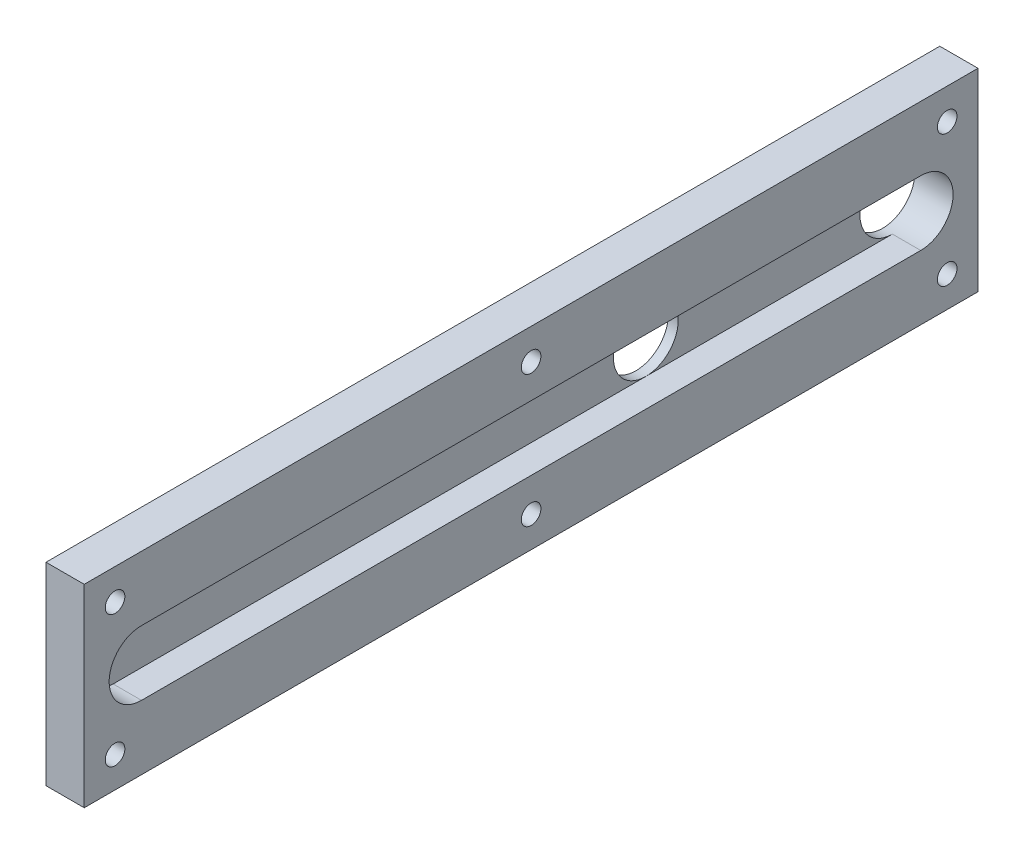
ISO-10303-21;
HEADER;
FILE_DESCRIPTION(('STEP AP214'),'2;1');
FILE_NAME('part.step','',(''),(''),'','','');
FILE_SCHEMA(('AUTOMOTIVE_DESIGN { 1 0 10303 214 1 1 1 1 }'));
ENDSEC;
DATA;
#1=APPLICATION_CONTEXT('core data for automotive mechanical design processes');
#2=APPLICATION_PROTOCOL_DEFINITION('international standard','automotive_design',2000,#1);
#3=PRODUCT_CONTEXT('',#1,'mechanical');
#4=PRODUCT('Part','Part','',(#3));
#5=PRODUCT_RELATED_PRODUCT_CATEGORY('part','',(#4));
#6=PRODUCT_DEFINITION_FORMATION('','',#4);
#7=PRODUCT_DEFINITION_CONTEXT('part definition',#1,'design');
#8=PRODUCT_DEFINITION('design','',#6,#7);
#9=PRODUCT_DEFINITION_SHAPE('','',#8);
#10=(LENGTH_UNIT() NAMED_UNIT(*) SI_UNIT(.MILLI.,.METRE.));
#11=(NAMED_UNIT(*) PLANE_ANGLE_UNIT() SI_UNIT($,.RADIAN.));
#12=(NAMED_UNIT(*) SI_UNIT($,.STERADIAN.) SOLID_ANGLE_UNIT());
#13=UNCERTAINTY_MEASURE_WITH_UNIT(LENGTH_MEASURE(1.E-05),#10,'distance_accuracy_value','');
#14=(GEOMETRIC_REPRESENTATION_CONTEXT(3) GLOBAL_UNCERTAINTY_ASSIGNED_CONTEXT((#13)) GLOBAL_UNIT_ASSIGNED_CONTEXT((#10,
#11,#12)) REPRESENTATION_CONTEXT('',''));
#15=CARTESIAN_POINT('',(0.,0.,0.));
#16=DIRECTION('',(0.,0.,1.));
#17=DIRECTION('',(1.,0.,0.));
#18=AXIS2_PLACEMENT_3D('',#15,#16,#17);
#19=CARTESIAN_POINT('',(7.874,-6.66750000000002,80.27524839));
#20=DIRECTION('',(0.,1.,0.));
#21=DIRECTION('',(0.,0.,1.));
#22=AXIS2_PLACEMENT_3D('',#19,#20,#21);
#23=PLANE('',#22);
#24=DIRECTION('',(0.,0.,-1.));
#25=VECTOR('',#24,1.);
#26=CARTESIAN_POINT('',(2.032,-6.6675,0.));
#27=LINE('',#26,#25);
#28=CARTESIAN_POINT('',(2.032,-6.6675,-29.47524839));
#29=VERTEX_POINT('',#28);
#30=CARTESIAN_POINT('',(2.032,-6.66749999999999,-80.2752483900001));
#31=VERTEX_POINT('',#30);
#32=EDGE_CURVE('E158',#29,#31,#27,.T.);
#33=ORIENTED_EDGE('',*,*,#32,.F.);
#34=DIRECTION('',(0.,0.,-1.));
#35=VECTOR('',#34,1.);
#36=CARTESIAN_POINT('',(2.032,-6.6675,0.));
#37=LINE('',#36,#35);
#38=CARTESIAN_POINT('',(2.032,-6.66750000000002,80.27524839));
#39=VERTEX_POINT('',#38);
#40=EDGE_CURVE('E64',#39,#29,#37,.T.);
#41=ORIENTED_EDGE('',*,*,#40,.F.);
#42=DIRECTION('',(-1.,0.,0.));
#43=VECTOR('',#42,1.);
#44=CARTESIAN_POINT('',(7.874,-6.66750000000002,80.27524839));
#45=LINE('',#44,#43);
#46=CARTESIAN_POINT('',(7.874,-6.66750000000002,80.27524839));
#47=VERTEX_POINT('',#46);
#48=EDGE_CURVE('E219',#47,#39,#45,.T.);
#49=ORIENTED_EDGE('',*,*,#48,.F.);
#50=DIRECTION('',(0.,0.,-1.));
#51=VECTOR('',#50,1.);
#52=CARTESIAN_POINT('',(7.874,-6.66750000000002,80.27524839));
#53=LINE('',#52,#51);
#54=CARTESIAN_POINT('',(7.874,-6.66749999999999,-80.2752483900001));
#55=VERTEX_POINT('',#54);
#56=EDGE_CURVE('E203',#47,#55,#53,.T.);
#57=ORIENTED_EDGE('',*,*,#56,.T.);
#58=DIRECTION('',(-1.,0.,0.));
#59=VECTOR('',#58,1.);
#60=CARTESIAN_POINT('',(7.874,-6.66749999999999,-80.2752483900001));
#61=LINE('',#60,#59);
#62=EDGE_CURVE('E217',#55,#31,#61,.T.);
#63=ORIENTED_EDGE('',*,*,#62,.T.);
#64=EDGE_LOOP('',(#33,#41,#49,#57,#63));
#65=FACE_BOUND('',#64,.T.);
#66=ADVANCED_FACE('F49',(#65),#23,.T.);
#67=CARTESIAN_POINT('',(7.874,0.,80.27524839));
#68=DIRECTION('',(-1.,0.,0.));
#69=DIRECTION('',(0.,0.,1.));
#70=AXIS2_PLACEMENT_3D('',#67,#68,#69);
#71=CYLINDRICAL_SURFACE('',#70,6.66750000000003);
#72=ORIENTED_EDGE('',*,*,#48,.T.);
#73=CARTESIAN_POINT('',(2.032,0.,80.27524839));
#74=DIRECTION('',(-1.,0.,0.));
#75=DIRECTION('',(0.,0.,1.));
#76=AXIS2_PLACEMENT_3D('',#73,#74,#75);
#77=CIRCLE('',#76,6.66750000000003);
#78=CARTESIAN_POINT('',(2.032,6.66750000000004,80.27524839));
#79=VERTEX_POINT('',#78);
#80=EDGE_CURVE('E71',#79,#39,#77,.F.);
#81=ORIENTED_EDGE('',*,*,#80,.F.);
#82=DIRECTION('',(-1.,0.,0.));
#83=VECTOR('',#82,1.);
#84=CARTESIAN_POINT('',(7.874,6.66750000000004,80.27524839));
#85=LINE('',#84,#83);
#86=CARTESIAN_POINT('',(7.874,6.66750000000004,80.27524839));
#87=VERTEX_POINT('',#86);
#88=EDGE_CURVE('E129',#87,#79,#85,.T.);
#89=ORIENTED_EDGE('',*,*,#88,.F.);
#90=CARTESIAN_POINT('',(7.874,0.,80.27524839));
#91=DIRECTION('',(1.,0.,0.));
#92=DIRECTION('',(0.,0.,-1.));
#93=AXIS2_PLACEMENT_3D('',#90,#91,#92);
#94=CIRCLE('',#93,6.66750000000003);
#95=EDGE_CURVE('E201',#87,#47,#94,.T.);
#96=ORIENTED_EDGE('',*,*,#95,.T.);
#97=EDGE_LOOP('',(#72,#81,#89,#96));
#98=FACE_BOUND('',#97,.T.);
#99=ADVANCED_FACE('F276',(#98),#71,.F.);
#100=CARTESIAN_POINT('',(7.874,6.66750000000004,80.27524839));
#101=DIRECTION('',(0.,-1.,0.));
#102=DIRECTION('',(0.,0.,-1.));
#103=AXIS2_PLACEMENT_3D('',#100,#101,#102);
#104=PLANE('',#103);
#105=ORIENTED_EDGE('',*,*,#88,.T.);
#106=DIRECTION('',(0.,0.,1.));
#107=VECTOR('',#106,1.);
#108=CARTESIAN_POINT('',(2.032,6.66750000000006,0.));
#109=LINE('',#108,#107);
#110=CARTESIAN_POINT('',(2.032,6.66750000000006,-29.47524839));
#111=VERTEX_POINT('',#110);
#112=EDGE_CURVE('E124',#111,#79,#109,.T.);
#113=ORIENTED_EDGE('',*,*,#112,.F.);
#114=DIRECTION('',(0.,0.,1.));
#115=VECTOR('',#114,1.);
#116=CARTESIAN_POINT('',(2.032,6.66750000000006,0.));
#117=LINE('',#116,#115);
#118=CARTESIAN_POINT('',(2.032,6.66750000000007,-80.2752483900001));
#119=VERTEX_POINT('',#118);
#120=EDGE_CURVE('E127',#119,#111,#117,.T.);
#121=ORIENTED_EDGE('',*,*,#120,.F.);
#122=DIRECTION('',(-1.,0.,0.));
#123=VECTOR('',#122,1.);
#124=CARTESIAN_POINT('',(7.874,6.66750000000007,-80.2752483900001));
#125=LINE('',#124,#123);
#126=CARTESIAN_POINT('',(7.874,6.66750000000007,-80.2752483900001));
#127=VERTEX_POINT('',#126);
#128=EDGE_CURVE('E215',#127,#119,#125,.T.);
#129=ORIENTED_EDGE('',*,*,#128,.F.);
#130=DIRECTION('',(0.,0.,1.));
#131=VECTOR('',#130,1.);
#132=CARTESIAN_POINT('',(7.874,6.66750000000004,80.27524839));
#133=LINE('',#132,#131);
#134=EDGE_CURVE('E209',#127,#87,#133,.T.);
#135=ORIENTED_EDGE('',*,*,#134,.T.);
#136=EDGE_LOOP('',(#105,#113,#121,#129,#135));
#137=FACE_BOUND('',#136,.T.);
#138=ADVANCED_FACE('F126',(#137),#104,.T.);
#139=CARTESIAN_POINT('',(7.874,0.,0.));
#140=DIRECTION('',(1.,0.,0.));
#141=DIRECTION('',(0.,0.,-1.));
#142=AXIS2_PLACEMENT_3D('',#139,#140,#141);
#143=PLANE('',#142);
#144=CARTESIAN_POINT('',(7.874,13.589,85.725));
#145=DIRECTION('',(1.,0.,0.));
#146=DIRECTION('',(0.,0.,-1.));
#147=AXIS2_PLACEMENT_3D('',#144,#145,#146);
#148=CIRCLE('',#147,2.0193);
#149=CARTESIAN_POINT('',(7.874,13.589,83.7057));
#150=VERTEX_POINT('',#149);
#151=EDGE_CURVE('E161',#150,#150,#148,.T.);
#152=ORIENTED_EDGE('',*,*,#151,.F.);
#153=EDGE_LOOP('',(#152));
#154=FACE_BOUND('',#153,.T.);
#155=CARTESIAN_POINT('',(7.874,-13.589,85.725));
#156=DIRECTION('',(1.,0.,0.));
#157=DIRECTION('',(0.,0.,-1.));
#158=AXIS2_PLACEMENT_3D('',#155,#156,#157);
#159=CIRCLE('',#158,2.0193);
#160=CARTESIAN_POINT('',(7.874,-13.589,83.7057));
#161=VERTEX_POINT('',#160);
#162=EDGE_CURVE('E170',#161,#161,#159,.T.);
#163=ORIENTED_EDGE('',*,*,#162,.F.);
#164=EDGE_LOOP('',(#163));
#165=FACE_BOUND('',#164,.T.);
#166=CARTESIAN_POINT('',(7.874,-13.589,0.));
#167=DIRECTION('',(1.,0.,0.));
#168=DIRECTION('',(0.,0.,-1.));
#169=AXIS2_PLACEMENT_3D('',#166,#167,#168);
#170=CIRCLE('',#169,2.0193);
#171=CARTESIAN_POINT('',(7.874,-13.589,-2.0193));
#172=VERTEX_POINT('',#171);
#173=EDGE_CURVE('E176',#172,#172,#170,.T.);
#174=ORIENTED_EDGE('',*,*,#173,.F.);
#175=EDGE_LOOP('',(#174));
#176=FACE_BOUND('',#175,.T.);
#177=CARTESIAN_POINT('',(7.874,-13.589,-85.725));
#178=DIRECTION('',(1.,0.,0.));
#179=DIRECTION('',(0.,0.,-1.));
#180=AXIS2_PLACEMENT_3D('',#177,#178,#179);
#181=CIRCLE('',#180,2.0193);
#182=CARTESIAN_POINT('',(7.874,-13.589,-87.7443));
#183=VERTEX_POINT('',#182);
#184=EDGE_CURVE('E182',#183,#183,#181,.T.);
#185=ORIENTED_EDGE('',*,*,#184,.F.);
#186=EDGE_LOOP('',(#185));
#187=FACE_BOUND('',#186,.T.);
#188=CARTESIAN_POINT('',(7.874,13.589,-85.725));
#189=DIRECTION('',(1.,0.,0.));
#190=DIRECTION('',(0.,0.,-1.));
#191=AXIS2_PLACEMENT_3D('',#188,#189,#190);
#192=CIRCLE('',#191,2.0193);
#193=CARTESIAN_POINT('',(7.874,13.589,-87.7443));
#194=VERTEX_POINT('',#193);
#195=EDGE_CURVE('E188',#194,#194,#192,.T.);
#196=ORIENTED_EDGE('',*,*,#195,.F.);
#197=EDGE_LOOP('',(#196));
#198=FACE_BOUND('',#197,.T.);
#199=CARTESIAN_POINT('',(7.874,13.589,0.));
#200=DIRECTION('',(1.,0.,0.));
#201=DIRECTION('',(0.,0.,-1.));
#202=AXIS2_PLACEMENT_3D('',#199,#200,#201);
#203=CIRCLE('',#202,2.0193);
#204=CARTESIAN_POINT('',(7.874,13.589,-2.0193));
#205=VERTEX_POINT('',#204);
#206=EDGE_CURVE('E194',#205,#205,#203,.T.);
#207=ORIENTED_EDGE('',*,*,#206,.F.);
#208=EDGE_LOOP('',(#207));
#209=FACE_BOUND('',#208,.T.);
#210=DIRECTION('',(0.,-1.,0.));
#211=VECTOR('',#210,1.);
#212=CARTESIAN_POINT('',(7.874,-19.939,92.075));
#213=LINE('',#212,#211);
#214=CARTESIAN_POINT('',(7.874,19.939,92.075));
#215=VERTEX_POINT('',#214);
#216=CARTESIAN_POINT('',(7.874,-19.939,92.075));
#217=VERTEX_POINT('',#216);
#218=EDGE_CURVE('E222',#215,#217,#213,.T.);
#219=ORIENTED_EDGE('',*,*,#218,.T.);
#220=DIRECTION('',(0.,0.,-1.));
#221=VECTOR('',#220,1.);
#222=CARTESIAN_POINT('',(7.874,-19.939,-92.075));
#223=LINE('',#222,#221);
#224=CARTESIAN_POINT('',(7.874,-19.939,-92.075));
#225=VERTEX_POINT('',#224);
#226=EDGE_CURVE('E225',#217,#225,#223,.T.);
#227=ORIENTED_EDGE('',*,*,#226,.T.);
#228=DIRECTION('',(0.,1.,0.));
#229=VECTOR('',#228,1.);
#230=CARTESIAN_POINT('',(7.874,-19.939,-92.075));
#231=LINE('',#230,#229);
#232=CARTESIAN_POINT('',(7.874,19.939,-92.075));
#233=VERTEX_POINT('',#232);
#234=EDGE_CURVE('E229',#225,#233,#231,.T.);
#235=ORIENTED_EDGE('',*,*,#234,.T.);
#236=DIRECTION('',(0.,0.,1.));
#237=VECTOR('',#236,1.);
#238=CARTESIAN_POINT('',(7.874,19.939,-92.075));
#239=LINE('',#238,#237);
#240=EDGE_CURVE('E231',#233,#215,#239,.T.);
#241=ORIENTED_EDGE('',*,*,#240,.T.);
#242=EDGE_LOOP('',(#219,#227,#235,#241));
#243=FACE_BOUND('',#242,.T.);
#244=ORIENTED_EDGE('',*,*,#56,.F.);
#245=ORIENTED_EDGE('',*,*,#95,.F.);
#246=ORIENTED_EDGE('',*,*,#134,.F.);
#247=CARTESIAN_POINT('',(7.874,0.,-80.27524839));
#248=DIRECTION('',(1.,0.,0.));
#249=DIRECTION('',(0.,0.,-1.));
#250=AXIS2_PLACEMENT_3D('',#247,#248,#249);
#251=CIRCLE('',#250,6.66750000000003);
#252=EDGE_CURVE('E206',#55,#127,#251,.T.);
#253=ORIENTED_EDGE('',*,*,#252,.F.);
#254=EDGE_LOOP('',(#244,#245,#246,#253));
#255=FACE_BOUND('',#254,.T.);
#256=ADVANCED_FACE('F266',(#154,#165,#176,#187,#198,#209,#243,#255),#143,.T.);
#257=CARTESIAN_POINT('',(0.,0.,0.));
#258=DIRECTION('',(1.,0.,0.));
#259=DIRECTION('',(0.,0.,-1.));
#260=AXIS2_PLACEMENT_3D('',#257,#258,#259);
#261=PLANE('',#260);
#262=CARTESIAN_POINT('',(0.,0.,-29.47524839));
#263=DIRECTION('',(-1.,0.,0.));
#264=DIRECTION('',(0.,0.,1.));
#265=AXIS2_PLACEMENT_3D('',#262,#263,#264);
#266=CIRCLE('',#265,6.66750000000001);
#267=CARTESIAN_POINT('',(0.,0.,-22.80774839));
#268=VERTEX_POINT('',#267);
#269=EDGE_CURVE('E149',#268,#268,#266,.T.);
#270=ORIENTED_EDGE('',*,*,#269,.F.);
#271=EDGE_LOOP('',(#270));
#272=FACE_BOUND('',#271,.T.);
#273=CARTESIAN_POINT('',(0.,0.,-80.27524839));
#274=DIRECTION('',(1.,0.,0.));
#275=DIRECTION('',(0.,0.,-1.));
#276=AXIS2_PLACEMENT_3D('',#273,#274,#275);
#277=CIRCLE('',#276,6.66750000000003);
#278=CARTESIAN_POINT('',(0.,0.,-86.9427483900001));
#279=VERTEX_POINT('',#278);
#280=EDGE_CURVE('E200',#279,#279,#277,.T.);
#281=ORIENTED_EDGE('',*,*,#280,.T.);
#282=EDGE_LOOP('',(#281));
#283=FACE_BOUND('',#282,.T.);
#284=CARTESIAN_POINT('',(0.,13.589,85.725));
#285=DIRECTION('',(1.,0.,0.));
#286=DIRECTION('',(0.,0.,-1.));
#287=AXIS2_PLACEMENT_3D('',#284,#285,#286);
#288=CIRCLE('',#287,2.0193);
#289=CARTESIAN_POINT('',(0.,13.589,83.7057));
#290=VERTEX_POINT('',#289);
#291=EDGE_CURVE('E167',#290,#290,#288,.T.);
#292=ORIENTED_EDGE('',*,*,#291,.T.);
#293=EDGE_LOOP('',(#292));
#294=FACE_BOUND('',#293,.T.);
#295=CARTESIAN_POINT('',(0.,-13.589,85.725));
#296=DIRECTION('',(1.,0.,0.));
#297=DIRECTION('',(0.,0.,-1.));
#298=AXIS2_PLACEMENT_3D('',#295,#296,#297);
#299=CIRCLE('',#298,2.0193);
#300=CARTESIAN_POINT('',(0.,-13.589,83.7057));
#301=VERTEX_POINT('',#300);
#302=EDGE_CURVE('E173',#301,#301,#299,.T.);
#303=ORIENTED_EDGE('',*,*,#302,.T.);
#304=EDGE_LOOP('',(#303));
#305=FACE_BOUND('',#304,.T.);
#306=CARTESIAN_POINT('',(0.,-13.589,0.));
#307=DIRECTION('',(1.,0.,0.));
#308=DIRECTION('',(0.,0.,-1.));
#309=AXIS2_PLACEMENT_3D('',#306,#307,#308);
#310=CIRCLE('',#309,2.0193);
#311=CARTESIAN_POINT('',(0.,-13.589,-2.0193));
#312=VERTEX_POINT('',#311);
#313=EDGE_CURVE('E179',#312,#312,#310,.T.);
#314=ORIENTED_EDGE('',*,*,#313,.T.);
#315=EDGE_LOOP('',(#314));
#316=FACE_BOUND('',#315,.T.);
#317=CARTESIAN_POINT('',(0.,-13.589,-85.725));
#318=DIRECTION('',(1.,0.,0.));
#319=DIRECTION('',(0.,0.,-1.));
#320=AXIS2_PLACEMENT_3D('',#317,#318,#319);
#321=CIRCLE('',#320,2.0193);
#322=CARTESIAN_POINT('',(0.,-13.589,-87.7443));
#323=VERTEX_POINT('',#322);
#324=EDGE_CURVE('E185',#323,#323,#321,.T.);
#325=ORIENTED_EDGE('',*,*,#324,.T.);
#326=EDGE_LOOP('',(#325));
#327=FACE_BOUND('',#326,.T.);
#328=CARTESIAN_POINT('',(0.,13.589,-85.725));
#329=DIRECTION('',(1.,0.,0.));
#330=DIRECTION('',(0.,0.,-1.));
#331=AXIS2_PLACEMENT_3D('',#328,#329,#330);
#332=CIRCLE('',#331,2.0193);
#333=CARTESIAN_POINT('',(0.,13.589,-87.7443));
#334=VERTEX_POINT('',#333);
#335=EDGE_CURVE('E191',#334,#334,#332,.T.);
#336=ORIENTED_EDGE('',*,*,#335,.T.);
#337=EDGE_LOOP('',(#336));
#338=FACE_BOUND('',#337,.T.);
#339=CARTESIAN_POINT('',(0.,13.589,0.));
#340=DIRECTION('',(1.,0.,0.));
#341=DIRECTION('',(0.,0.,-1.));
#342=AXIS2_PLACEMENT_3D('',#339,#340,#341);
#343=CIRCLE('',#342,2.0193);
#344=CARTESIAN_POINT('',(0.,13.589,-2.0193));
#345=VERTEX_POINT('',#344);
#346=EDGE_CURVE('E197',#345,#345,#343,.T.);
#347=ORIENTED_EDGE('',*,*,#346,.T.);
#348=EDGE_LOOP('',(#347));
#349=FACE_BOUND('',#348,.T.);
#350=DIRECTION('',(0.,-1.,0.));
#351=VECTOR('',#350,1.);
#352=CARTESIAN_POINT('',(0.,-19.939,92.075));
#353=LINE('',#352,#351);
#354=CARTESIAN_POINT('',(0.,19.939,92.075));
#355=VERTEX_POINT('',#354);
#356=CARTESIAN_POINT('',(0.,-19.939,92.075));
#357=VERTEX_POINT('',#356);
#358=EDGE_CURVE('E221',#355,#357,#353,.T.);
#359=ORIENTED_EDGE('',*,*,#358,.F.);
#360=DIRECTION('',(0.,0.,1.));
#361=VECTOR('',#360,1.);
#362=CARTESIAN_POINT('',(0.,19.939,-92.075));
#363=LINE('',#362,#361);
#364=CARTESIAN_POINT('',(0.,19.939,-92.075));
#365=VERTEX_POINT('',#364);
#366=EDGE_CURVE('E226',#365,#355,#363,.T.);
#367=ORIENTED_EDGE('',*,*,#366,.F.);
#368=DIRECTION('',(0.,1.,0.));
#369=VECTOR('',#368,1.);
#370=CARTESIAN_POINT('',(0.,-19.939,-92.075));
#371=LINE('',#370,#369);
#372=CARTESIAN_POINT('',(0.,-19.939,-92.075));
#373=VERTEX_POINT('',#372);
#374=EDGE_CURVE('E239',#373,#365,#371,.T.);
#375=ORIENTED_EDGE('',*,*,#374,.F.);
#376=DIRECTION('',(0.,0.,-1.));
#377=VECTOR('',#376,1.);
#378=CARTESIAN_POINT('',(0.,-19.939,-92.075));
#379=LINE('',#378,#377);
#380=EDGE_CURVE('E236',#357,#373,#379,.T.);
#381=ORIENTED_EDGE('',*,*,#380,.F.);
#382=EDGE_LOOP('',(#359,#367,#375,#381));
#383=FACE_BOUND('',#382,.T.);
#384=ADVANCED_FACE('F257',(#272,#283,#294,#305,#316,#327,#338,#349,#383),#261,.F.);
#385=CARTESIAN_POINT('',(7.874,-19.939,92.075));
#386=DIRECTION('',(0.,0.,-1.));
#387=DIRECTION('',(-1.,0.,0.));
#388=AXIS2_PLACEMENT_3D('',#385,#386,#387);
#389=PLANE('',#388);
#390=ORIENTED_EDGE('',*,*,#358,.T.);
#391=DIRECTION('',(-1.,0.,0.));
#392=VECTOR('',#391,1.);
#393=CARTESIAN_POINT('',(7.874,-19.939,92.075));
#394=LINE('',#393,#392);
#395=EDGE_CURVE('E11',#217,#357,#394,.T.);
#396=ORIENTED_EDGE('',*,*,#395,.F.);
#397=ORIENTED_EDGE('',*,*,#218,.F.);
#398=DIRECTION('',(-1.,0.,0.));
#399=VECTOR('',#398,1.);
#400=CARTESIAN_POINT('',(7.874,19.939,92.075));
#401=LINE('',#400,#399);
#402=EDGE_CURVE('E233',#215,#355,#401,.T.);
#403=ORIENTED_EDGE('',*,*,#402,.T.);
#404=EDGE_LOOP('',(#390,#396,#397,#403));
#405=FACE_BOUND('',#404,.T.);
#406=ADVANCED_FACE('F51',(#405),#389,.F.);
#407=CARTESIAN_POINT('',(7.874,-19.939,-92.075));
#408=DIRECTION('',(0.,1.,0.));
#409=DIRECTION('',(0.,0.,1.));
#410=AXIS2_PLACEMENT_3D('',#407,#408,#409);
#411=PLANE('',#410);
#412=ORIENTED_EDGE('',*,*,#380,.T.);
#413=DIRECTION('',(-1.,0.,0.));
#414=VECTOR('',#413,1.);
#415=CARTESIAN_POINT('',(7.874,-19.939,-92.075));
#416=LINE('',#415,#414);
#417=EDGE_CURVE('E57',#225,#373,#416,.T.);
#418=ORIENTED_EDGE('',*,*,#417,.F.);
#419=ORIENTED_EDGE('',*,*,#226,.F.);
#420=ORIENTED_EDGE('',*,*,#395,.T.);
#421=EDGE_LOOP('',(#412,#418,#419,#420));
#422=FACE_BOUND('',#421,.T.);
#423=ADVANCED_FACE('F268',(#422),#411,.F.);
#424=CARTESIAN_POINT('',(7.874,-19.939,-92.075));
#425=DIRECTION('',(0.,0.,1.));
#426=DIRECTION('',(1.,0.,0.));
#427=AXIS2_PLACEMENT_3D('',#424,#425,#426);
#428=PLANE('',#427);
#429=ORIENTED_EDGE('',*,*,#374,.T.);
#430=DIRECTION('',(-1.,0.,0.));
#431=VECTOR('',#430,1.);
#432=CARTESIAN_POINT('',(7.874,19.939,-92.075));
#433=LINE('',#432,#431);
#434=EDGE_CURVE('E244',#233,#365,#433,.T.);
#435=ORIENTED_EDGE('',*,*,#434,.F.);
#436=ORIENTED_EDGE('',*,*,#234,.F.);
#437=ORIENTED_EDGE('',*,*,#417,.T.);
#438=EDGE_LOOP('',(#429,#435,#436,#437));
#439=FACE_BOUND('',#438,.T.);
#440=ADVANCED_FACE('F251',(#439),#428,.F.);
#441=CARTESIAN_POINT('',(7.874,19.939,-92.075));
#442=DIRECTION('',(0.,-1.,0.));
#443=DIRECTION('',(0.,0.,-1.));
#444=AXIS2_PLACEMENT_3D('',#441,#442,#443);
#445=PLANE('',#444);
#446=ORIENTED_EDGE('',*,*,#366,.T.);
#447=ORIENTED_EDGE('',*,*,#402,.F.);
#448=ORIENTED_EDGE('',*,*,#240,.F.);
#449=ORIENTED_EDGE('',*,*,#434,.T.);
#450=EDGE_LOOP('',(#446,#447,#448,#449));
#451=FACE_BOUND('',#450,.T.);
#452=ADVANCED_FACE('F260',(#451),#445,.F.);
#453=CARTESIAN_POINT('',(7.874,0.,-80.27524839));
#454=DIRECTION('',(-1.,0.,0.));
#455=DIRECTION('',(0.,0.,1.));
#456=AXIS2_PLACEMENT_3D('',#453,#454,#455);
#457=CYLINDRICAL_SURFACE('',#456,6.66750000000003);
#458=ORIENTED_EDGE('',*,*,#280,.F.);
#459=EDGE_LOOP('',(#458));
#460=FACE_BOUND('',#459,.T.);
#461=CARTESIAN_POINT('',(2.032,0.,-80.27524839));
#462=DIRECTION('',(-1.,0.,0.));
#463=DIRECTION('',(0.,0.,1.));
#464=AXIS2_PLACEMENT_3D('',#461,#462,#463);
#465=CIRCLE('',#464,6.66750000000003);
#466=EDGE_CURVE('E142',#31,#119,#465,.T.);
#467=ORIENTED_EDGE('',*,*,#466,.F.);
#468=ORIENTED_EDGE('',*,*,#62,.F.);
#469=ORIENTED_EDGE('',*,*,#252,.T.);
#470=ORIENTED_EDGE('',*,*,#128,.T.);
#471=EDGE_LOOP('',(#467,#468,#469,#470));
#472=FACE_BOUND('',#471,.T.);
#473=ADVANCED_FACE('F283',(#460,#472),#457,.F.);
#474=CARTESIAN_POINT('',(7.874,13.589,0.));
#475=DIRECTION('',(1.,0.,0.));
#476=DIRECTION('',(0.,0.,-1.));
#477=AXIS2_PLACEMENT_3D('',#474,#475,#476);
#478=CYLINDRICAL_SURFACE('',#477,2.0193);
#479=ORIENTED_EDGE('',*,*,#346,.F.);
#480=EDGE_LOOP('',(#479));
#481=FACE_BOUND('',#480,.T.);
#482=ORIENTED_EDGE('',*,*,#206,.T.);
#483=EDGE_LOOP('',(#482));
#484=FACE_BOUND('',#483,.T.);
#485=ADVANCED_FACE('F296',(#481,#484),#478,.F.);
#486=CARTESIAN_POINT('',(7.874,13.589,-85.725));
#487=DIRECTION('',(1.,0.,0.));
#488=DIRECTION('',(0.,0.,-1.));
#489=AXIS2_PLACEMENT_3D('',#486,#487,#488);
#490=CYLINDRICAL_SURFACE('',#489,2.0193);
#491=ORIENTED_EDGE('',*,*,#335,.F.);
#492=EDGE_LOOP('',(#491));
#493=FACE_BOUND('',#492,.T.);
#494=ORIENTED_EDGE('',*,*,#195,.T.);
#495=EDGE_LOOP('',(#494));
#496=FACE_BOUND('',#495,.T.);
#497=ADVANCED_FACE('F301',(#493,#496),#490,.F.);
#498=CARTESIAN_POINT('',(7.874,-13.589,-85.725));
#499=DIRECTION('',(1.,0.,0.));
#500=DIRECTION('',(0.,0.,-1.));
#501=AXIS2_PLACEMENT_3D('',#498,#499,#500);
#502=CYLINDRICAL_SURFACE('',#501,2.0193);
#503=ORIENTED_EDGE('',*,*,#324,.F.);
#504=EDGE_LOOP('',(#503));
#505=FACE_BOUND('',#504,.T.);
#506=ORIENTED_EDGE('',*,*,#184,.T.);
#507=EDGE_LOOP('',(#506));
#508=FACE_BOUND('',#507,.T.);
#509=ADVANCED_FACE('F331',(#505,#508),#502,.F.);
#510=CARTESIAN_POINT('',(7.874,-13.589,0.));
#511=DIRECTION('',(1.,0.,0.));
#512=DIRECTION('',(0.,0.,-1.));
#513=AXIS2_PLACEMENT_3D('',#510,#511,#512);
#514=CYLINDRICAL_SURFACE('',#513,2.0193);
#515=ORIENTED_EDGE('',*,*,#313,.F.);
#516=EDGE_LOOP('',(#515));
#517=FACE_BOUND('',#516,.T.);
#518=ORIENTED_EDGE('',*,*,#173,.T.);
#519=EDGE_LOOP('',(#518));
#520=FACE_BOUND('',#519,.T.);
#521=ADVANCED_FACE('F338',(#517,#520),#514,.F.);
#522=CARTESIAN_POINT('',(7.874,-13.589,85.725));
#523=DIRECTION('',(1.,0.,0.));
#524=DIRECTION('',(0.,0.,-1.));
#525=AXIS2_PLACEMENT_3D('',#522,#523,#524);
#526=CYLINDRICAL_SURFACE('',#525,2.0193);
#527=ORIENTED_EDGE('',*,*,#302,.F.);
#528=EDGE_LOOP('',(#527));
#529=FACE_BOUND('',#528,.T.);
#530=ORIENTED_EDGE('',*,*,#162,.T.);
#531=EDGE_LOOP('',(#530));
#532=FACE_BOUND('',#531,.T.);
#533=ADVANCED_FACE('F424',(#529,#532),#526,.F.);
#534=CARTESIAN_POINT('',(7.874,13.589,85.725));
#535=DIRECTION('',(1.,0.,0.));
#536=DIRECTION('',(0.,0.,-1.));
#537=AXIS2_PLACEMENT_3D('',#534,#535,#536);
#538=CYLINDRICAL_SURFACE('',#537,2.0193);
#539=ORIENTED_EDGE('',*,*,#291,.F.);
#540=EDGE_LOOP('',(#539));
#541=FACE_BOUND('',#540,.T.);
#542=ORIENTED_EDGE('',*,*,#151,.T.);
#543=EDGE_LOOP('',(#542));
#544=FACE_BOUND('',#543,.T.);
#545=ADVANCED_FACE('F436',(#541,#544),#538,.F.);
#546=CARTESIAN_POINT('',(2.032,0.,-29.47524839));
#547=DIRECTION('',(-1.,0.,0.));
#548=DIRECTION('',(0.,0.,1.));
#549=AXIS2_PLACEMENT_3D('',#546,#547,#548);
#550=CYLINDRICAL_SURFACE('',#549,6.66750000000001);
#551=ORIENTED_EDGE('',*,*,#269,.T.);
#552=EDGE_LOOP('',(#551));
#553=FACE_BOUND('',#552,.T.);
#554=CARTESIAN_POINT('',(2.032,0.,-29.47524839));
#555=DIRECTION('',(-1.,0.,0.));
#556=DIRECTION('',(0.,0.,1.));
#557=AXIS2_PLACEMENT_3D('',#554,#555,#556);
#558=CIRCLE('',#557,6.66750000000001);
#559=EDGE_CURVE('E140',#111,#29,#558,.T.);
#560=ORIENTED_EDGE('',*,*,#559,.F.);
#561=CARTESIAN_POINT('',(2.032,0.,-29.47524839));
#562=DIRECTION('',(-1.,0.,0.));
#563=DIRECTION('',(0.,0.,1.));
#564=AXIS2_PLACEMENT_3D('',#561,#562,#563);
#565=CIRCLE('',#564,6.66750000000001);
#566=EDGE_CURVE('E133',#29,#111,#565,.T.);
#567=ORIENTED_EDGE('',*,*,#566,.F.);
#568=EDGE_LOOP('',(#560,#567));
#569=FACE_BOUND('',#568,.T.);
#570=ADVANCED_FACE('F147',(#553,#569),#550,.F.);
#571=CARTESIAN_POINT('',(2.032,0.,0.));
#572=DIRECTION('',(-1.,0.,0.));
#573=DIRECTION('',(0.,0.,1.));
#574=AXIS2_PLACEMENT_3D('',#571,#572,#573);
#575=PLANE('',#574);
#576=ORIENTED_EDGE('',*,*,#559,.T.);
#577=ORIENTED_EDGE('',*,*,#32,.T.);
#578=ORIENTED_EDGE('',*,*,#466,.T.);
#579=ORIENTED_EDGE('',*,*,#120,.T.);
#580=EDGE_LOOP('',(#576,#577,#578,#579));
#581=FACE_BOUND('',#580,.T.);
#582=ADVANCED_FACE('F138',(#581),#575,.F.);
#583=CARTESIAN_POINT('',(2.032,0.,0.));
#584=DIRECTION('',(-1.,0.,0.));
#585=DIRECTION('',(0.,0.,1.));
#586=AXIS2_PLACEMENT_3D('',#583,#584,#585);
#587=PLANE('',#586);
#588=ORIENTED_EDGE('',*,*,#566,.T.);
#589=ORIENTED_EDGE('',*,*,#112,.T.);
#590=ORIENTED_EDGE('',*,*,#80,.T.);
#591=ORIENTED_EDGE('',*,*,#40,.T.);
#592=EDGE_LOOP('',(#588,#589,#590,#591));
#593=FACE_BOUND('',#592,.T.);
#594=ADVANCED_FACE('F151',(#593),#587,.F.);
#595=CLOSED_SHELL('',(#66,#99,#138,#256,#384,#406,#423,#440,#452,#473,#485,#497,#509,#521,#533,
#545,#570,#582,#594));
#596=MANIFOLD_SOLID_BREP('B2',#595);
#597=ADVANCED_BREP_SHAPE_REPRESENTATION('',(#18,#596),#14);
#598=SHAPE_DEFINITION_REPRESENTATION(#9,#597);
ENDSEC;
END-ISO-10303-21;
